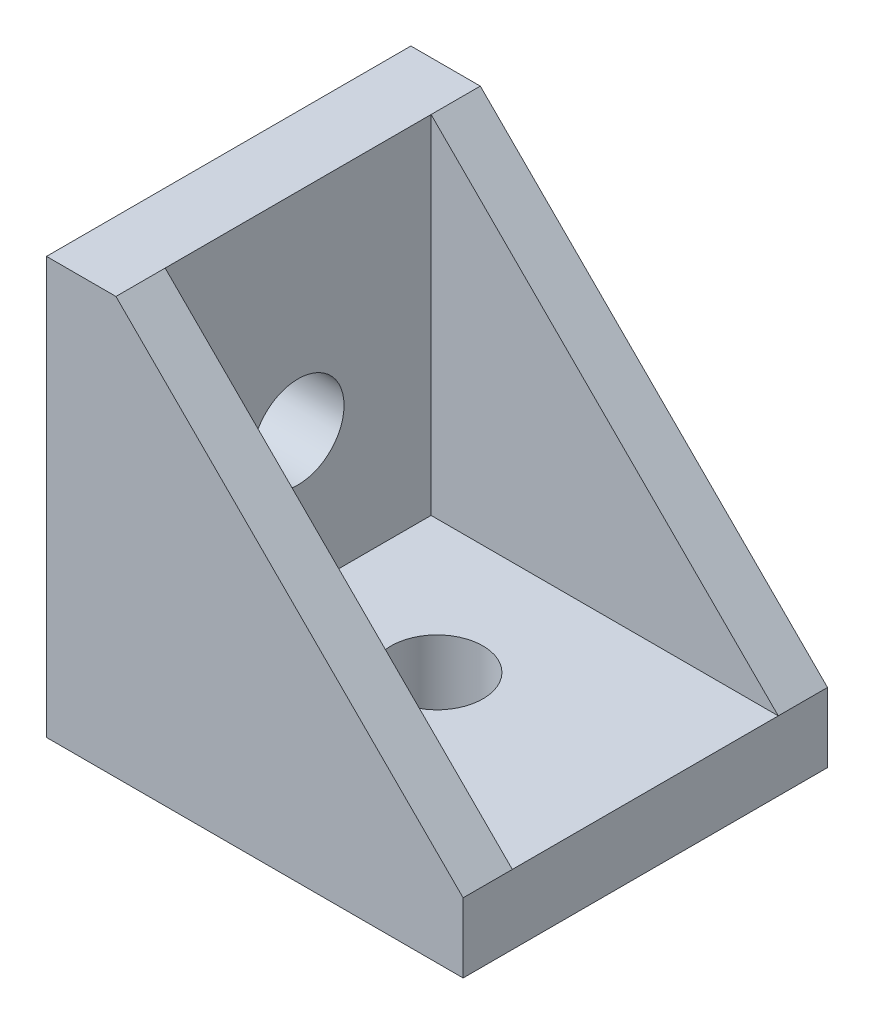
ISO-10303-21;
HEADER;
FILE_DESCRIPTION(('STEP AP214'),'2;1');
FILE_NAME('part.step','',(''),(''),'','','');
FILE_SCHEMA(('AUTOMOTIVE_DESIGN { 1 0 10303 214 1 1 1 1 }'));
ENDSEC;
DATA;
#1=APPLICATION_CONTEXT('core data for automotive mechanical design processes');
#2=APPLICATION_PROTOCOL_DEFINITION('international standard','automotive_design',2000,#1);
#3=PRODUCT_CONTEXT('',#1,'mechanical');
#4=PRODUCT('Part','Part','',(#3));
#5=PRODUCT_RELATED_PRODUCT_CATEGORY('part','',(#4));
#6=PRODUCT_DEFINITION_FORMATION('','',#4);
#7=PRODUCT_DEFINITION_CONTEXT('part definition',#1,'design');
#8=PRODUCT_DEFINITION('design','',#6,#7);
#9=PRODUCT_DEFINITION_SHAPE('','',#8);
#10=(LENGTH_UNIT() NAMED_UNIT(*) SI_UNIT(.MILLI.,.METRE.));
#11=(NAMED_UNIT(*) PLANE_ANGLE_UNIT() SI_UNIT($,.RADIAN.));
#12=(NAMED_UNIT(*) SI_UNIT($,.STERADIAN.) SOLID_ANGLE_UNIT());
#13=UNCERTAINTY_MEASURE_WITH_UNIT(LENGTH_MEASURE(1.E-05),#10,'distance_accuracy_value','');
#14=(GEOMETRIC_REPRESENTATION_CONTEXT(3) GLOBAL_UNCERTAINTY_ASSIGNED_CONTEXT((#13)) GLOBAL_UNIT_ASSIGNED_CONTEXT((#10,
#11,#12)) REPRESENTATION_CONTEXT('',''));
#15=CARTESIAN_POINT('',(0.,0.,0.));
#16=DIRECTION('',(0.,0.,1.));
#17=DIRECTION('',(1.,0.,0.));
#18=AXIS2_PLACEMENT_3D('',#15,#16,#17);
#19=CARTESIAN_POINT('',(38.1,6.35,16.66));
#20=DIRECTION('',(-0.707106781186547,-0.707106781186547,0.));
#21=DIRECTION('',(0.707106781186548,-0.707106781186548,0.));
#22=AXIS2_PLACEMENT_3D('',#19,#20,#21);
#23=PLANE('',#22);
#24=DIRECTION('',(-0.707106781186548,0.707106781186548,0.));
#25=VECTOR('',#24,1.);
#26=CARTESIAN_POINT('',(38.1,6.35,-12.16));
#27=LINE('',#26,#25);
#28=CARTESIAN_POINT('',(38.1,6.35,-12.16));
#29=VERTEX_POINT('',#28);
#30=CARTESIAN_POINT('',(6.35,38.1,-12.16));
#31=VERTEX_POINT('',#30);
#32=EDGE_CURVE('E11',#29,#31,#27,.T.);
#33=ORIENTED_EDGE('',*,*,#32,.F.);
#34=DIRECTION('',(0.,0.,-1.));
#35=VECTOR('',#34,1.);
#36=CARTESIAN_POINT('',(38.1,6.35,16.66));
#37=LINE('',#36,#35);
#38=CARTESIAN_POINT('',(38.1,6.35,-16.66));
#39=VERTEX_POINT('',#38);
#40=EDGE_CURVE('E122',#29,#39,#37,.T.);
#41=ORIENTED_EDGE('',*,*,#40,.T.);
#42=DIRECTION('',(-0.707106781186548,0.707106781186548,0.));
#43=VECTOR('',#42,1.);
#44=CARTESIAN_POINT('',(38.1,6.35,-16.66));
#45=LINE('',#44,#43);
#46=CARTESIAN_POINT('',(6.35,38.1,-16.66));
#47=VERTEX_POINT('',#46);
#48=EDGE_CURVE('E139',#39,#47,#45,.T.);
#49=ORIENTED_EDGE('',*,*,#48,.T.);
#50=DIRECTION('',(0.,0.,-1.));
#51=VECTOR('',#50,1.);
#52=CARTESIAN_POINT('',(6.35,38.1,16.66));
#53=LINE('',#52,#51);
#54=EDGE_CURVE('E145',#31,#47,#53,.T.);
#55=ORIENTED_EDGE('',*,*,#54,.F.);
#56=EDGE_LOOP('',(#33,#41,#49,#55));
#57=FACE_BOUND('',#56,.T.);
#58=ADVANCED_FACE('F39',(#57),#23,.F.);
#59=CARTESIAN_POINT('',(0.,38.1,16.66));
#60=DIRECTION('',(1.,0.,0.));
#61=DIRECTION('',(0.,0.,-1.));
#62=AXIS2_PLACEMENT_3D('',#59,#60,#61);
#63=PLANE('',#62);
#64=CARTESIAN_POINT('',(0.,19.05,0.));
#65=DIRECTION('',(1.,0.,0.));
#66=DIRECTION('',(0.,0.,-1.));
#67=AXIS2_PLACEMENT_3D('',#64,#65,#66);
#68=CIRCLE('',#67,4.2);
#69=CARTESIAN_POINT('',(0.,19.05,-4.2));
#70=VERTEX_POINT('',#69);
#71=EDGE_CURVE('E181',#70,#70,#68,.T.);
#72=ORIENTED_EDGE('',*,*,#71,.T.);
#73=EDGE_LOOP('',(#72));
#74=FACE_BOUND('',#73,.T.);
#75=DIRECTION('',(0.,-1.,0.));
#76=VECTOR('',#75,1.);
#77=CARTESIAN_POINT('',(0.,38.1,-16.66));
#78=LINE('',#77,#76);
#79=CARTESIAN_POINT('',(0.,38.1,-16.66));
#80=VERTEX_POINT('',#79);
#81=CARTESIAN_POINT('',(0.,0.,-16.66));
#82=VERTEX_POINT('',#81);
#83=EDGE_CURVE('E131',#80,#82,#78,.T.);
#84=ORIENTED_EDGE('',*,*,#83,.T.);
#85=DIRECTION('',(0.,0.,-1.));
#86=VECTOR('',#85,1.);
#87=CARTESIAN_POINT('',(0.,0.,16.66));
#88=LINE('',#87,#86);
#89=CARTESIAN_POINT('',(0.,0.,16.66));
#90=VERTEX_POINT('',#89);
#91=EDGE_CURVE('E149',#90,#82,#88,.T.);
#92=ORIENTED_EDGE('',*,*,#91,.F.);
#93=DIRECTION('',(0.,-1.,0.));
#94=VECTOR('',#93,1.);
#95=CARTESIAN_POINT('',(0.,38.1,16.66));
#96=LINE('',#95,#94);
#97=CARTESIAN_POINT('',(0.,38.1,16.66));
#98=VERTEX_POINT('',#97);
#99=EDGE_CURVE('E143',#98,#90,#96,.T.);
#100=ORIENTED_EDGE('',*,*,#99,.F.);
#101=DIRECTION('',(0.,0.,-1.));
#102=VECTOR('',#101,1.);
#103=CARTESIAN_POINT('',(0.,38.1,16.66));
#104=LINE('',#103,#102);
#105=EDGE_CURVE('E127',#98,#80,#104,.T.);
#106=ORIENTED_EDGE('',*,*,#105,.T.);
#107=EDGE_LOOP('',(#84,#92,#100,#106));
#108=FACE_BOUND('',#107,.T.);
#109=ADVANCED_FACE('F41',(#74,#108),#63,.F.);
#110=CARTESIAN_POINT('',(0.,0.,16.66));
#111=DIRECTION('',(0.,1.,0.));
#112=DIRECTION('',(0.,0.,1.));
#113=AXIS2_PLACEMENT_3D('',#110,#111,#112);
#114=PLANE('',#113);
#115=CARTESIAN_POINT('',(19.05,0.,0.));
#116=DIRECTION('',(0.,1.,0.));
#117=DIRECTION('',(0.,0.,1.));
#118=AXIS2_PLACEMENT_3D('',#115,#116,#117);
#119=CIRCLE('',#118,4.2);
#120=CARTESIAN_POINT('',(19.05,0.,4.2));
#121=VERTEX_POINT('',#120);
#122=EDGE_CURVE('E174',#121,#121,#119,.T.);
#123=ORIENTED_EDGE('',*,*,#122,.T.);
#124=EDGE_LOOP('',(#123));
#125=FACE_BOUND('',#124,.T.);
#126=DIRECTION('',(1.,0.,0.));
#127=VECTOR('',#126,1.);
#128=CARTESIAN_POINT('',(0.,0.,-16.66));
#129=LINE('',#128,#127);
#130=CARTESIAN_POINT('',(38.1,0.,-16.66));
#131=VERTEX_POINT('',#130);
#132=EDGE_CURVE('E134',#82,#131,#129,.T.);
#133=ORIENTED_EDGE('',*,*,#132,.T.);
#134=DIRECTION('',(0.,0.,-1.));
#135=VECTOR('',#134,1.);
#136=CARTESIAN_POINT('',(38.1,0.,16.66));
#137=LINE('',#136,#135);
#138=CARTESIAN_POINT('',(38.1,0.,16.66));
#139=VERTEX_POINT('',#138);
#140=EDGE_CURVE('E120',#139,#131,#137,.T.);
#141=ORIENTED_EDGE('',*,*,#140,.F.);
#142=DIRECTION('',(1.,0.,0.));
#143=VECTOR('',#142,1.);
#144=CARTESIAN_POINT('',(0.,0.,16.66));
#145=LINE('',#144,#143);
#146=EDGE_CURVE('E94',#90,#139,#145,.T.);
#147=ORIENTED_EDGE('',*,*,#146,.F.);
#148=ORIENTED_EDGE('',*,*,#91,.T.);
#149=EDGE_LOOP('',(#133,#141,#147,#148));
#150=FACE_BOUND('',#149,.T.);
#151=ADVANCED_FACE('F225',(#125,#150),#114,.F.);
#152=CARTESIAN_POINT('',(38.1,0.,16.66));
#153=DIRECTION('',(-1.,0.,0.));
#154=DIRECTION('',(0.,0.,1.));
#155=AXIS2_PLACEMENT_3D('',#152,#153,#154);
#156=PLANE('',#155);
#157=DIRECTION('',(0.,1.,0.));
#158=VECTOR('',#157,1.);
#159=CARTESIAN_POINT('',(38.1,0.,-16.66));
#160=LINE('',#159,#158);
#161=EDGE_CURVE('E137',#131,#39,#160,.T.);
#162=ORIENTED_EDGE('',*,*,#161,.T.);
#163=ORIENTED_EDGE('',*,*,#40,.F.);
#164=CARTESIAN_POINT('',(38.1,6.35,12.16));
#165=VERTEX_POINT('',#164);
#166=EDGE_CURVE('E117',#165,#29,#37,.T.);
#167=ORIENTED_EDGE('',*,*,#166,.F.);
#168=CARTESIAN_POINT('',(38.1,6.35,16.66));
#169=VERTEX_POINT('',#168);
#170=EDGE_CURVE('E111',#169,#165,#37,.T.);
#171=ORIENTED_EDGE('',*,*,#170,.F.);
#172=DIRECTION('',(0.,1.,0.));
#173=VECTOR('',#172,1.);
#174=CARTESIAN_POINT('',(38.1,0.,16.66));
#175=LINE('',#174,#173);
#176=EDGE_CURVE('E100',#139,#169,#175,.T.);
#177=ORIENTED_EDGE('',*,*,#176,.F.);
#178=ORIENTED_EDGE('',*,*,#140,.T.);
#179=EDGE_LOOP('',(#162,#163,#167,#171,#177,#178));
#180=FACE_BOUND('',#179,.T.);
#181=ADVANCED_FACE('F113',(#180),#156,.F.);
#182=ORIENTED_EDGE('',*,*,#170,.T.);
#183=DIRECTION('',(-0.707106781186548,0.707106781186548,0.));
#184=VECTOR('',#183,1.);
#185=CARTESIAN_POINT('',(38.1,6.35,12.16));
#186=LINE('',#185,#184);
#187=CARTESIAN_POINT('',(6.35,38.1,12.16));
#188=VERTEX_POINT('',#187);
#189=EDGE_CURVE('E47',#165,#188,#186,.T.);
#190=ORIENTED_EDGE('',*,*,#189,.T.);
#191=CARTESIAN_POINT('',(6.35,38.1,16.66));
#192=VERTEX_POINT('',#191);
#193=EDGE_CURVE('E125',#192,#188,#53,.T.);
#194=ORIENTED_EDGE('',*,*,#193,.F.);
#195=DIRECTION('',(-0.707106781186548,0.707106781186548,0.));
#196=VECTOR('',#195,1.);
#197=CARTESIAN_POINT('',(38.1,6.35,16.66));
#198=LINE('',#197,#196);
#199=EDGE_CURVE('E104',#169,#192,#198,.T.);
#200=ORIENTED_EDGE('',*,*,#199,.F.);
#201=EDGE_LOOP('',(#182,#190,#194,#200));
#202=FACE_BOUND('',#201,.T.);
#203=ADVANCED_FACE('F123',(#202),#23,.F.);
#204=CARTESIAN_POINT('',(6.35,38.1,16.66));
#205=DIRECTION('',(0.,-1.,0.));
#206=DIRECTION('',(0.,0.,-1.));
#207=AXIS2_PLACEMENT_3D('',#204,#205,#206);
#208=PLANE('',#207);
#209=DIRECTION('',(-1.,0.,0.));
#210=VECTOR('',#209,1.);
#211=CARTESIAN_POINT('',(6.35,38.1,-16.66));
#212=LINE('',#211,#210);
#213=EDGE_CURVE('E85',#47,#80,#212,.T.);
#214=ORIENTED_EDGE('',*,*,#213,.T.);
#215=ORIENTED_EDGE('',*,*,#105,.F.);
#216=DIRECTION('',(-1.,0.,0.));
#217=VECTOR('',#216,1.);
#218=CARTESIAN_POINT('',(6.35,38.1,16.66));
#219=LINE('',#218,#217);
#220=EDGE_CURVE('E62',#192,#98,#219,.T.);
#221=ORIENTED_EDGE('',*,*,#220,.F.);
#222=ORIENTED_EDGE('',*,*,#193,.T.);
#223=EDGE_CURVE('E146',#188,#31,#53,.T.);
#224=ORIENTED_EDGE('',*,*,#223,.T.);
#225=ORIENTED_EDGE('',*,*,#54,.T.);
#226=EDGE_LOOP('',(#214,#215,#221,#222,#224,#225));
#227=FACE_BOUND('',#226,.T.);
#228=ADVANCED_FACE('F159',(#227),#208,.F.);
#229=CARTESIAN_POINT('',(0.,0.,16.66));
#230=DIRECTION('',(0.,0.,1.));
#231=DIRECTION('',(1.,0.,0.));
#232=AXIS2_PLACEMENT_3D('',#229,#230,#231);
#233=PLANE('',#232);
#234=ORIENTED_EDGE('',*,*,#99,.T.);
#235=ORIENTED_EDGE('',*,*,#146,.T.);
#236=ORIENTED_EDGE('',*,*,#176,.T.);
#237=ORIENTED_EDGE('',*,*,#199,.T.);
#238=ORIENTED_EDGE('',*,*,#220,.T.);
#239=EDGE_LOOP('',(#234,#235,#236,#237,#238));
#240=FACE_BOUND('',#239,.T.);
#241=ADVANCED_FACE('F102',(#240),#233,.T.);
#242=CARTESIAN_POINT('',(0.,0.,-16.66));
#243=DIRECTION('',(0.,0.,1.));
#244=DIRECTION('',(1.,0.,0.));
#245=AXIS2_PLACEMENT_3D('',#242,#243,#244);
#246=PLANE('',#245);
#247=ORIENTED_EDGE('',*,*,#83,.F.);
#248=ORIENTED_EDGE('',*,*,#213,.F.);
#249=ORIENTED_EDGE('',*,*,#48,.F.);
#250=ORIENTED_EDGE('',*,*,#161,.F.);
#251=ORIENTED_EDGE('',*,*,#132,.F.);
#252=EDGE_LOOP('',(#247,#248,#249,#250,#251));
#253=FACE_BOUND('',#252,.T.);
#254=ADVANCED_FACE('F243',(#253),#246,.F.);
#255=CARTESIAN_POINT('',(6.35,6.35,-12.16));
#256=DIRECTION('',(0.,-1.,0.));
#257=DIRECTION('',(0.,0.,-1.));
#258=AXIS2_PLACEMENT_3D('',#255,#256,#257);
#259=PLANE('',#258);
#260=CARTESIAN_POINT('',(19.05,6.35,0.));
#261=DIRECTION('',(0.,1.,0.));
#262=DIRECTION('',(0.,0.,1.));
#263=AXIS2_PLACEMENT_3D('',#260,#261,#262);
#264=CIRCLE('',#263,4.2);
#265=CARTESIAN_POINT('',(19.05,6.35,4.2));
#266=VERTEX_POINT('',#265);
#267=EDGE_CURVE('E178',#266,#266,#264,.T.);
#268=ORIENTED_EDGE('',*,*,#267,.F.);
#269=EDGE_LOOP('',(#268));
#270=FACE_BOUND('',#269,.T.);
#271=DIRECTION('',(1.,0.,0.));
#272=VECTOR('',#271,1.);
#273=CARTESIAN_POINT('',(6.35,6.35,-12.16));
#274=LINE('',#273,#272);
#275=CARTESIAN_POINT('',(6.35,6.35,-12.16));
#276=VERTEX_POINT('',#275);
#277=EDGE_CURVE('E168',#276,#29,#274,.T.);
#278=ORIENTED_EDGE('',*,*,#277,.F.);
#279=DIRECTION('',(0.,0.,1.));
#280=VECTOR('',#279,1.);
#281=CARTESIAN_POINT('',(6.35,6.35,-12.16));
#282=LINE('',#281,#280);
#283=CARTESIAN_POINT('',(6.35,6.35,12.16));
#284=VERTEX_POINT('',#283);
#285=EDGE_CURVE('E135',#276,#284,#282,.T.);
#286=ORIENTED_EDGE('',*,*,#285,.T.);
#287=DIRECTION('',(1.,0.,0.));
#288=VECTOR('',#287,1.);
#289=CARTESIAN_POINT('',(6.35,6.35,12.16));
#290=LINE('',#289,#288);
#291=EDGE_CURVE('E169',#284,#165,#290,.T.);
#292=ORIENTED_EDGE('',*,*,#291,.T.);
#293=ORIENTED_EDGE('',*,*,#166,.T.);
#294=EDGE_LOOP('',(#278,#286,#292,#293));
#295=FACE_BOUND('',#294,.T.);
#296=ADVANCED_FACE('F206',(#270,#295),#259,.F.);
#297=CARTESIAN_POINT('',(0.,0.,-12.16));
#298=DIRECTION('',(0.,0.,1.));
#299=DIRECTION('',(1.,0.,0.));
#300=AXIS2_PLACEMENT_3D('',#297,#298,#299);
#301=PLANE('',#300);
#302=ORIENTED_EDGE('',*,*,#32,.T.);
#303=DIRECTION('',(0.,-1.,0.));
#304=VECTOR('',#303,1.);
#305=CARTESIAN_POINT('',(6.35,48.1,-12.16));
#306=LINE('',#305,#304);
#307=EDGE_CURVE('E54',#31,#276,#306,.T.);
#308=ORIENTED_EDGE('',*,*,#307,.T.);
#309=ORIENTED_EDGE('',*,*,#277,.T.);
#310=EDGE_LOOP('',(#302,#308,#309));
#311=FACE_BOUND('',#310,.T.);
#312=ADVANCED_FACE('F208',(#311),#301,.T.);
#313=CARTESIAN_POINT('',(0.,0.,12.16));
#314=DIRECTION('',(0.,0.,1.));
#315=DIRECTION('',(1.,0.,0.));
#316=AXIS2_PLACEMENT_3D('',#313,#314,#315);
#317=PLANE('',#316);
#318=ORIENTED_EDGE('',*,*,#291,.F.);
#319=DIRECTION('',(0.,-1.,0.));
#320=VECTOR('',#319,1.);
#321=CARTESIAN_POINT('',(6.35,48.1,12.16));
#322=LINE('',#321,#320);
#323=EDGE_CURVE('E171',#188,#284,#322,.T.);
#324=ORIENTED_EDGE('',*,*,#323,.F.);
#325=ORIENTED_EDGE('',*,*,#189,.F.);
#326=EDGE_LOOP('',(#318,#324,#325));
#327=FACE_BOUND('',#326,.T.);
#328=ADVANCED_FACE('F200',(#327),#317,.F.);
#329=CARTESIAN_POINT('',(6.35,48.1,-12.16));
#330=DIRECTION('',(-1.,0.,0.));
#331=DIRECTION('',(0.,0.,1.));
#332=AXIS2_PLACEMENT_3D('',#329,#330,#331);
#333=PLANE('',#332);
#334=CARTESIAN_POINT('',(6.35,19.05,0.));
#335=DIRECTION('',(1.,0.,0.));
#336=DIRECTION('',(0.,0.,-1.));
#337=AXIS2_PLACEMENT_3D('',#334,#335,#336);
#338=CIRCLE('',#337,4.2);
#339=CARTESIAN_POINT('',(6.35,19.05,-4.2));
#340=VERTEX_POINT('',#339);
#341=EDGE_CURVE('E184',#340,#340,#338,.T.);
#342=ORIENTED_EDGE('',*,*,#341,.F.);
#343=EDGE_LOOP('',(#342));
#344=FACE_BOUND('',#343,.T.);
#345=ORIENTED_EDGE('',*,*,#323,.T.);
#346=ORIENTED_EDGE('',*,*,#285,.F.);
#347=ORIENTED_EDGE('',*,*,#307,.F.);
#348=ORIENTED_EDGE('',*,*,#223,.F.);
#349=EDGE_LOOP('',(#345,#346,#347,#348));
#350=FACE_BOUND('',#349,.T.);
#351=ADVANCED_FACE('F198',(#344,#350),#333,.F.);
#352=CARTESIAN_POINT('',(19.05,0.,0.));
#353=DIRECTION('',(0.,1.,0.));
#354=DIRECTION('',(0.,0.,1.));
#355=AXIS2_PLACEMENT_3D('',#352,#353,#354);
#356=CYLINDRICAL_SURFACE('',#355,4.2);
#357=ORIENTED_EDGE('',*,*,#122,.F.);
#358=EDGE_LOOP('',(#357));
#359=FACE_BOUND('',#358,.T.);
#360=ORIENTED_EDGE('',*,*,#267,.T.);
#361=EDGE_LOOP('',(#360));
#362=FACE_BOUND('',#361,.T.);
#363=ADVANCED_FACE('F194',(#359,#362),#356,.F.);
#364=CARTESIAN_POINT('',(0.,19.05,0.));
#365=DIRECTION('',(1.,0.,0.));
#366=DIRECTION('',(0.,0.,-1.));
#367=AXIS2_PLACEMENT_3D('',#364,#365,#366);
#368=CYLINDRICAL_SURFACE('',#367,4.2);
#369=ORIENTED_EDGE('',*,*,#71,.F.);
#370=EDGE_LOOP('',(#369));
#371=FACE_BOUND('',#370,.T.);
#372=ORIENTED_EDGE('',*,*,#341,.T.);
#373=EDGE_LOOP('',(#372));
#374=FACE_BOUND('',#373,.T.);
#375=ADVANCED_FACE('F191',(#371,#374),#368,.F.);
#376=CLOSED_SHELL('',(#58,#109,#151,#181,#203,#228,#241,#254,#296,#312,#328,#351,#363,#375));
#377=MANIFOLD_SOLID_BREP('B2',#376);
#378=ADVANCED_BREP_SHAPE_REPRESENTATION('',(#18,#377),#14);
#379=SHAPE_DEFINITION_REPRESENTATION(#9,#378);
ENDSEC;
END-ISO-10303-21;
